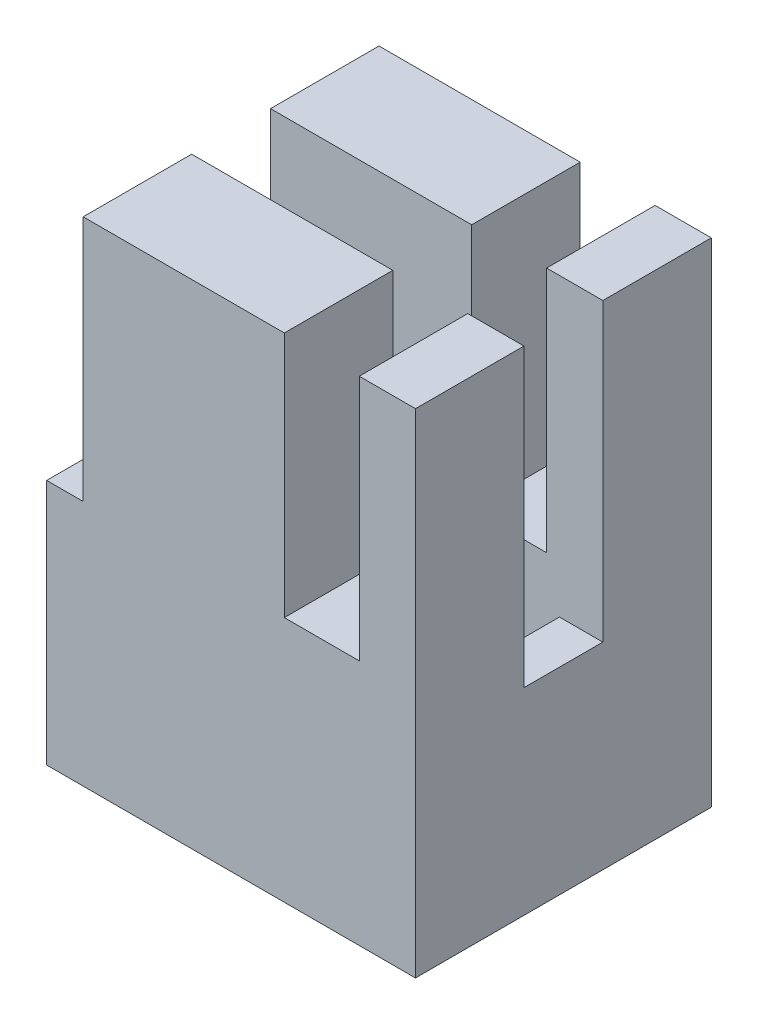
ISO-10303-21;
HEADER;
FILE_DESCRIPTION(('STEP AP214'),'2;1');
FILE_NAME('part.step','',(''),(''),'','','');
FILE_SCHEMA(('AUTOMOTIVE_DESIGN { 1 0 10303 214 1 1 1 1 }'));
ENDSEC;
DATA;
#1=APPLICATION_CONTEXT('core data for automotive mechanical design processes');
#2=APPLICATION_PROTOCOL_DEFINITION('international standard','automotive_design',2000,#1);
#3=PRODUCT_CONTEXT('',#1,'mechanical');
#4=PRODUCT('Part','Part','',(#3));
#5=PRODUCT_RELATED_PRODUCT_CATEGORY('part','',(#4));
#6=PRODUCT_DEFINITION_FORMATION('','',#4);
#7=PRODUCT_DEFINITION_CONTEXT('part definition',#1,'design');
#8=PRODUCT_DEFINITION('design','',#6,#7);
#9=PRODUCT_DEFINITION_SHAPE('','',#8);
#10=(LENGTH_UNIT() NAMED_UNIT(*) SI_UNIT(.MILLI.,.METRE.));
#11=(NAMED_UNIT(*) PLANE_ANGLE_UNIT() SI_UNIT($,.RADIAN.));
#12=(NAMED_UNIT(*) SI_UNIT($,.STERADIAN.) SOLID_ANGLE_UNIT());
#13=UNCERTAINTY_MEASURE_WITH_UNIT(LENGTH_MEASURE(1.E-05),#10,'distance_accuracy_value','');
#14=(GEOMETRIC_REPRESENTATION_CONTEXT(3) GLOBAL_UNCERTAINTY_ASSIGNED_CONTEXT((#13)) GLOBAL_UNIT_ASSIGNED_CONTEXT((#10,
#11,#12)) REPRESENTATION_CONTEXT('',''));
#15=CARTESIAN_POINT('',(0.,0.,0.));
#16=DIRECTION('',(0.,0.,1.));
#17=DIRECTION('',(1.,0.,0.));
#18=AXIS2_PLACEMENT_3D('',#15,#16,#17);
#19=CARTESIAN_POINT('',(0.,63.5,0.));
#20=DIRECTION('',(0.,1.,0.));
#21=DIRECTION('',(0.,0.,1.));
#22=AXIS2_PLACEMENT_3D('',#19,#20,#21);
#23=PLANE('',#22);
#24=DIRECTION('',(0.,0.,-1.));
#25=VECTOR('',#24,1.);
#26=CARTESIAN_POINT('',(16.51,63.5,-19.05));
#27=LINE('',#26,#25);
#28=CARTESIAN_POINT('',(16.51,63.5,19.05));
#29=VERTEX_POINT('',#28);
#30=CARTESIAN_POINT('',(16.51,63.5,5.07999999999999));
#31=VERTEX_POINT('',#30);
#32=EDGE_CURVE('E231',#29,#31,#27,.T.);
#33=ORIENTED_EDGE('',*,*,#32,.F.);
#34=DIRECTION('',(1.,0.,0.));
#35=VECTOR('',#34,1.);
#36=CARTESIAN_POINT('',(-23.749,63.5,19.05));
#37=LINE('',#36,#35);
#38=CARTESIAN_POINT('',(23.749,63.5,19.05));
#39=VERTEX_POINT('',#38);
#40=EDGE_CURVE('E249',#29,#39,#37,.T.);
#41=ORIENTED_EDGE('',*,*,#40,.T.);
#42=DIRECTION('',(0.,0.,-1.));
#43=VECTOR('',#42,1.);
#44=CARTESIAN_POINT('',(23.749,63.5,-19.05));
#45=LINE('',#44,#43);
#46=CARTESIAN_POINT('',(23.749,63.5,5.08));
#47=VERTEX_POINT('',#46);
#48=EDGE_CURVE('E255',#39,#47,#45,.T.);
#49=ORIENTED_EDGE('',*,*,#48,.T.);
#50=DIRECTION('',(1.,0.,0.));
#51=VECTOR('',#50,1.);
#52=CARTESIAN_POINT('',(-23.749,63.5,5.08));
#53=LINE('',#52,#51);
#54=EDGE_CURVE('E308',#31,#47,#53,.T.);
#55=ORIENTED_EDGE('',*,*,#54,.F.);
#56=EDGE_LOOP('',(#33,#41,#49,#55));
#57=FACE_BOUND('',#56,.T.);
#58=ADVANCED_FACE('F36',(#57),#23,.T.);
#59=CARTESIAN_POINT('',(-23.749,63.5,-19.05));
#60=DIRECTION('',(1.,0.,0.));
#61=DIRECTION('',(0.,0.,-1.));
#62=AXIS2_PLACEMENT_3D('',#59,#60,#61);
#63=PLANE('',#62);
#64=DIRECTION('',(0.,0.,-1.));
#65=VECTOR('',#64,1.);
#66=CARTESIAN_POINT('',(-23.749,31.75,-19.05));
#67=LINE('',#66,#65);
#68=CARTESIAN_POINT('',(-23.749,31.75,-5.08));
#69=VERTEX_POINT('',#68);
#70=CARTESIAN_POINT('',(-23.749,31.75,-19.05));
#71=VERTEX_POINT('',#70);
#72=EDGE_CURVE('E417',#69,#71,#67,.T.);
#73=ORIENTED_EDGE('',*,*,#72,.T.);
#74=DIRECTION('',(0.,-1.,0.));
#75=VECTOR('',#74,1.);
#76=CARTESIAN_POINT('',(-23.749,63.5,-19.05));
#77=LINE('',#76,#75);
#78=CARTESIAN_POINT('',(-23.749,0.,-19.05));
#79=VERTEX_POINT('',#78);
#80=EDGE_CURVE('E277',#71,#79,#77,.T.);
#81=ORIENTED_EDGE('',*,*,#80,.T.);
#82=DIRECTION('',(0.,0.,1.));
#83=VECTOR('',#82,1.);
#84=CARTESIAN_POINT('',(-23.749,0.,-19.05));
#85=LINE('',#84,#83);
#86=CARTESIAN_POINT('',(-23.749,0.,-8.5725));
#87=VERTEX_POINT('',#86);
#88=EDGE_CURVE('E267',#79,#87,#85,.T.);
#89=ORIENTED_EDGE('',*,*,#88,.T.);
#90=DIRECTION('',(0.,-1.,0.));
#91=VECTOR('',#90,1.);
#92=CARTESIAN_POINT('',(-23.749,70.681333074458,-8.5725));
#93=LINE('',#92,#91);
#94=CARTESIAN_POINT('',(-23.749,19.05,-8.5725));
#95=VERTEX_POINT('',#94);
#96=EDGE_CURVE('E351',#95,#87,#93,.T.);
#97=ORIENTED_EDGE('',*,*,#96,.F.);
#98=DIRECTION('',(0.,0.,-1.));
#99=VECTOR('',#98,1.);
#100=CARTESIAN_POINT('',(-23.749,19.05,-8.5725));
#101=LINE('',#100,#99);
#102=CARTESIAN_POINT('',(-23.749,19.05,8.5725));
#103=VERTEX_POINT('',#102);
#104=EDGE_CURVE('E349',#103,#95,#101,.T.);
#105=ORIENTED_EDGE('',*,*,#104,.F.);
#106=DIRECTION('',(0.,-1.,0.));
#107=VECTOR('',#106,1.);
#108=CARTESIAN_POINT('',(-23.749,70.681333074458,8.5725));
#109=LINE('',#108,#107);
#110=CARTESIAN_POINT('',(-23.749,0.,8.5725));
#111=VERTEX_POINT('',#110);
#112=EDGE_CURVE('E346',#103,#111,#109,.T.);
#113=ORIENTED_EDGE('',*,*,#112,.T.);
#114=CARTESIAN_POINT('',(-23.749,0.,19.05));
#115=VERTEX_POINT('',#114);
#116=EDGE_CURVE('E266',#111,#115,#85,.T.);
#117=ORIENTED_EDGE('',*,*,#116,.T.);
#118=DIRECTION('',(0.,-1.,0.));
#119=VECTOR('',#118,1.);
#120=CARTESIAN_POINT('',(-23.749,63.5,19.05));
#121=LINE('',#120,#119);
#122=CARTESIAN_POINT('',(-23.749,31.75,19.05));
#123=VERTEX_POINT('',#122);
#124=EDGE_CURVE('E275',#123,#115,#121,.T.);
#125=ORIENTED_EDGE('',*,*,#124,.F.);
#126=CARTESIAN_POINT('',(-23.749,31.75,5.08));
#127=VERTEX_POINT('',#126);
#128=EDGE_CURVE('E407',#123,#127,#67,.T.);
#129=ORIENTED_EDGE('',*,*,#128,.T.);
#130=DIRECTION('',(0.,1.,0.));
#131=VECTOR('',#130,1.);
#132=CARTESIAN_POINT('',(-23.749,25.4,5.08));
#133=LINE('',#132,#131);
#134=CARTESIAN_POINT('',(-23.749,25.4,5.08));
#135=VERTEX_POINT('',#134);
#136=EDGE_CURVE('E320',#135,#127,#133,.T.);
#137=ORIENTED_EDGE('',*,*,#136,.F.);
#138=DIRECTION('',(0.,0.,1.));
#139=VECTOR('',#138,1.);
#140=CARTESIAN_POINT('',(-23.749,25.4,-5.08));
#141=LINE('',#140,#139);
#142=CARTESIAN_POINT('',(-23.749,25.4,-5.08));
#143=VERTEX_POINT('',#142);
#144=EDGE_CURVE('E332',#143,#135,#141,.T.);
#145=ORIENTED_EDGE('',*,*,#144,.F.);
#146=DIRECTION('',(0.,1.,0.));
#147=VECTOR('',#146,1.);
#148=CARTESIAN_POINT('',(-23.749,25.4,-5.08));
#149=LINE('',#148,#147);
#150=EDGE_CURVE('E323',#143,#69,#149,.T.);
#151=ORIENTED_EDGE('',*,*,#150,.T.);
#152=EDGE_LOOP('',(#73,#81,#89,#97,#105,#113,#117,#125,#129,#137,#145,#151));
#153=FACE_BOUND('',#152,.T.);
#154=ADVANCED_FACE('F456',(#153),#63,.F.);
#155=CARTESIAN_POINT('',(16.51,63.5,-5.08));
#156=VERTEX_POINT('',#155);
#157=CARTESIAN_POINT('',(16.51,63.5,-19.05));
#158=VERTEX_POINT('',#157);
#159=EDGE_CURVE('E221',#156,#158,#27,.T.);
#160=ORIENTED_EDGE('',*,*,#159,.F.);
#161=DIRECTION('',(-1.,0.,0.));
#162=VECTOR('',#161,1.);
#163=CARTESIAN_POINT('',(-23.749,63.5,-5.08));
#164=LINE('',#163,#162);
#165=CARTESIAN_POINT('',(23.749,63.5,-5.08));
#166=VERTEX_POINT('',#165);
#167=EDGE_CURVE('E305',#166,#156,#164,.T.);
#168=ORIENTED_EDGE('',*,*,#167,.F.);
#169=CARTESIAN_POINT('',(23.749,63.5,-19.05));
#170=VERTEX_POINT('',#169);
#171=EDGE_CURVE('E248',#166,#170,#45,.T.);
#172=ORIENTED_EDGE('',*,*,#171,.T.);
#173=DIRECTION('',(-1.,0.,0.));
#174=VECTOR('',#173,1.);
#175=CARTESIAN_POINT('',(-23.749,63.5,-19.05));
#176=LINE('',#175,#174);
#177=EDGE_CURVE('E238',#170,#158,#176,.T.);
#178=ORIENTED_EDGE('',*,*,#177,.T.);
#179=EDGE_LOOP('',(#160,#168,#172,#178));
#180=FACE_BOUND('',#179,.T.);
#181=ADVANCED_FACE('F246',(#180),#23,.T.);
#182=CARTESIAN_POINT('',(0.,25.4,0.));
#183=DIRECTION('',(0.,1.,0.));
#184=DIRECTION('',(0.,0.,1.));
#185=AXIS2_PLACEMENT_3D('',#182,#183,#184);
#186=PLANE('',#185);
#187=DIRECTION('',(0.,0.,-1.));
#188=VECTOR('',#187,1.);
#189=CARTESIAN_POINT('',(18.161,25.4,5.08));
#190=LINE('',#189,#188);
#191=CARTESIAN_POINT('',(18.161,25.4,5.08));
#192=VERTEX_POINT('',#191);
#193=CARTESIAN_POINT('',(18.161,25.4,-5.08));
#194=VERTEX_POINT('',#193);
#195=EDGE_CURVE('E390',#192,#194,#190,.T.);
#196=ORIENTED_EDGE('',*,*,#195,.F.);
#197=DIRECTION('',(1.,0.,0.));
#198=VECTOR('',#197,1.);
#199=CARTESIAN_POINT('',(-23.749,25.4,5.08));
#200=LINE('',#199,#198);
#201=CARTESIAN_POINT('',(23.749,25.4,5.08));
#202=VERTEX_POINT('',#201);
#203=EDGE_CURVE('E328',#192,#202,#200,.T.);
#204=ORIENTED_EDGE('',*,*,#203,.T.);
#205=DIRECTION('',(0.,0.,-1.));
#206=VECTOR('',#205,1.);
#207=CARTESIAN_POINT('',(23.749,25.4,-5.08));
#208=LINE('',#207,#206);
#209=CARTESIAN_POINT('',(23.749,25.4,-5.08));
#210=VERTEX_POINT('',#209);
#211=EDGE_CURVE('E344',#202,#210,#208,.T.);
#212=ORIENTED_EDGE('',*,*,#211,.T.);
#213=DIRECTION('',(-1.,0.,0.));
#214=VECTOR('',#213,1.);
#215=CARTESIAN_POINT('',(-23.749,25.4,-5.08));
#216=LINE('',#215,#214);
#217=EDGE_CURVE('E338',#210,#194,#216,.T.);
#218=ORIENTED_EDGE('',*,*,#217,.T.);
#219=EDGE_LOOP('',(#196,#204,#212,#218));
#220=FACE_BOUND('',#219,.T.);
#221=ADVANCED_FACE('F503',(#220),#186,.T.);
#222=DIRECTION('',(0.,0.,1.));
#223=VECTOR('',#222,1.);
#224=CARTESIAN_POINT('',(6.858,63.5,-19.05));
#225=LINE('',#224,#223);
#226=CARTESIAN_POINT('',(6.858,63.5,5.07999999999999));
#227=VERTEX_POINT('',#226);
#228=CARTESIAN_POINT('',(6.858,63.5,19.05));
#229=VERTEX_POINT('',#228);
#230=EDGE_CURVE('E433',#227,#229,#225,.T.);
#231=ORIENTED_EDGE('',*,*,#230,.F.);
#232=CARTESIAN_POINT('',(-19.05,63.5,5.07999999999999));
#233=VERTEX_POINT('',#232);
#234=EDGE_CURVE('E317',#233,#227,#53,.T.);
#235=ORIENTED_EDGE('',*,*,#234,.F.);
#236=DIRECTION('',(0.,0.,-1.));
#237=VECTOR('',#236,1.);
#238=CARTESIAN_POINT('',(-19.05,63.5,-19.05));
#239=LINE('',#238,#237);
#240=CARTESIAN_POINT('',(-19.05,63.5,19.05));
#241=VERTEX_POINT('',#240);
#242=EDGE_CURVE('E411',#241,#233,#239,.T.);
#243=ORIENTED_EDGE('',*,*,#242,.F.);
#244=EDGE_CURVE('E252',#241,#229,#37,.T.);
#245=ORIENTED_EDGE('',*,*,#244,.T.);
#246=EDGE_LOOP('',(#231,#235,#243,#245));
#247=FACE_BOUND('',#246,.T.);
#248=ADVANCED_FACE('F517',(#247),#23,.T.);
#249=CARTESIAN_POINT('',(23.749,63.5,-19.05));
#250=DIRECTION('',(-1.,0.,0.));
#251=DIRECTION('',(0.,0.,1.));
#252=AXIS2_PLACEMENT_3D('',#249,#250,#251);
#253=PLANE('',#252);
#254=ORIENTED_EDGE('',*,*,#211,.F.);
#255=DIRECTION('',(0.,1.,0.));
#256=VECTOR('',#255,1.);
#257=CARTESIAN_POINT('',(23.749,25.4,5.08));
#258=LINE('',#257,#256);
#259=EDGE_CURVE('E263',#202,#47,#258,.T.);
#260=ORIENTED_EDGE('',*,*,#259,.T.);
#261=ORIENTED_EDGE('',*,*,#48,.F.);
#262=DIRECTION('',(0.,-1.,0.));
#263=VECTOR('',#262,1.);
#264=CARTESIAN_POINT('',(23.749,63.5,19.05));
#265=LINE('',#264,#263);
#266=CARTESIAN_POINT('',(23.749,0.,19.05));
#267=VERTEX_POINT('',#266);
#268=EDGE_CURVE('E272',#39,#267,#265,.T.);
#269=ORIENTED_EDGE('',*,*,#268,.T.);
#270=DIRECTION('',(0.,0.,-1.));
#271=VECTOR('',#270,1.);
#272=CARTESIAN_POINT('',(23.749,0.,-19.05));
#273=LINE('',#272,#271);
#274=CARTESIAN_POINT('',(23.749,0.,-19.05));
#275=VERTEX_POINT('',#274);
#276=EDGE_CURVE('E259',#267,#275,#273,.T.);
#277=ORIENTED_EDGE('',*,*,#276,.T.);
#278=DIRECTION('',(0.,-1.,0.));
#279=VECTOR('',#278,1.);
#280=CARTESIAN_POINT('',(23.749,63.5,-19.05));
#281=LINE('',#280,#279);
#282=EDGE_CURVE('E279',#170,#275,#281,.T.);
#283=ORIENTED_EDGE('',*,*,#282,.F.);
#284=ORIENTED_EDGE('',*,*,#171,.F.);
#285=DIRECTION('',(0.,1.,0.));
#286=VECTOR('',#285,1.);
#287=CARTESIAN_POINT('',(23.749,25.4,-5.08));
#288=LINE('',#287,#286);
#289=EDGE_CURVE('E325',#210,#166,#288,.T.);
#290=ORIENTED_EDGE('',*,*,#289,.F.);
#291=EDGE_LOOP('',(#254,#260,#261,#269,#277,#283,#284,#290));
#292=FACE_BOUND('',#291,.T.);
#293=ADVANCED_FACE('F38',(#292),#253,.F.);
#294=CARTESIAN_POINT('',(-23.749,63.5,-19.05));
#295=DIRECTION('',(0.,0.,1.));
#296=DIRECTION('',(1.,0.,0.));
#297=AXIS2_PLACEMENT_3D('',#294,#295,#296);
#298=PLANE('',#297);
#299=DIRECTION('',(1.,0.,0.));
#300=VECTOR('',#299,1.);
#301=CARTESIAN_POINT('',(16.51,31.75,-19.05));
#302=LINE('',#301,#300);
#303=CARTESIAN_POINT('',(6.858,31.75,-19.05));
#304=VERTEX_POINT('',#303);
#305=CARTESIAN_POINT('',(16.51,31.75,-19.05));
#306=VERTEX_POINT('',#305);
#307=EDGE_CURVE('E242',#304,#306,#302,.T.);
#308=ORIENTED_EDGE('',*,*,#307,.T.);
#309=DIRECTION('',(0.,1.,0.));
#310=VECTOR('',#309,1.);
#311=CARTESIAN_POINT('',(16.51,-13.9035762240537,-19.05));
#312=LINE('',#311,#310);
#313=EDGE_CURVE('E225',#306,#158,#312,.T.);
#314=ORIENTED_EDGE('',*,*,#313,.T.);
#315=ORIENTED_EDGE('',*,*,#177,.F.);
#316=ORIENTED_EDGE('',*,*,#282,.T.);
#317=DIRECTION('',(-1.,0.,0.));
#318=VECTOR('',#317,1.);
#319=CARTESIAN_POINT('',(-23.749,0.,-19.05));
#320=LINE('',#319,#318);
#321=EDGE_CURVE('E262',#275,#79,#320,.T.);
#322=ORIENTED_EDGE('',*,*,#321,.T.);
#323=ORIENTED_EDGE('',*,*,#80,.F.);
#324=DIRECTION('',(1.,0.,0.));
#325=VECTOR('',#324,1.);
#326=CARTESIAN_POINT('',(-23.749,31.75,-19.05));
#327=LINE('',#326,#325);
#328=CARTESIAN_POINT('',(-19.05,31.75,-19.05));
#329=VERTEX_POINT('',#328);
#330=EDGE_CURVE('E418',#71,#329,#327,.T.);
#331=ORIENTED_EDGE('',*,*,#330,.T.);
#332=DIRECTION('',(0.,1.,0.));
#333=VECTOR('',#332,1.);
#334=CARTESIAN_POINT('',(-19.05,-13.9035762240537,-19.05));
#335=LINE('',#334,#333);
#336=CARTESIAN_POINT('',(-19.05,63.5,-19.05));
#337=VERTEX_POINT('',#336);
#338=EDGE_CURVE('E410',#329,#337,#335,.T.);
#339=ORIENTED_EDGE('',*,*,#338,.T.);
#340=CARTESIAN_POINT('',(6.858,63.5,-19.05));
#341=VERTEX_POINT('',#340);
#342=EDGE_CURVE('E250',#341,#337,#176,.T.);
#343=ORIENTED_EDGE('',*,*,#342,.F.);
#344=DIRECTION('',(0.,1.,0.));
#345=VECTOR('',#344,1.);
#346=CARTESIAN_POINT('',(6.858,-13.9035762240537,-19.05));
#347=LINE('',#346,#345);
#348=EDGE_CURVE('E243',#304,#341,#347,.T.);
#349=ORIENTED_EDGE('',*,*,#348,.F.);
#350=EDGE_LOOP('',(#308,#314,#315,#316,#322,#323,#331,#339,#343,#349));
#351=FACE_BOUND('',#350,.T.);
#352=ADVANCED_FACE('F236',(#351),#298,.F.);
#353=CARTESIAN_POINT('',(-23.749,63.5,19.05));
#354=DIRECTION('',(0.,0.,-1.));
#355=DIRECTION('',(-1.,0.,0.));
#356=AXIS2_PLACEMENT_3D('',#353,#354,#355);
#357=PLANE('',#356);
#358=ORIENTED_EDGE('',*,*,#40,.F.);
#359=DIRECTION('',(0.,1.,0.));
#360=VECTOR('',#359,1.);
#361=CARTESIAN_POINT('',(16.51,-13.9035762240537,19.05));
#362=LINE('',#361,#360);
#363=CARTESIAN_POINT('',(16.51,31.75,19.05));
#364=VERTEX_POINT('',#363);
#365=EDGE_CURVE('E430',#364,#29,#362,.T.);
#366=ORIENTED_EDGE('',*,*,#365,.F.);
#367=DIRECTION('',(-1.,0.,0.));
#368=VECTOR('',#367,1.);
#369=CARTESIAN_POINT('',(16.51,31.75,19.05));
#370=LINE('',#369,#368);
#371=CARTESIAN_POINT('',(6.858,31.75,19.05));
#372=VERTEX_POINT('',#371);
#373=EDGE_CURVE('E436',#364,#372,#370,.T.);
#374=ORIENTED_EDGE('',*,*,#373,.T.);
#375=DIRECTION('',(0.,1.,0.));
#376=VECTOR('',#375,1.);
#377=CARTESIAN_POINT('',(6.858,-13.9035762240537,19.05));
#378=LINE('',#377,#376);
#379=EDGE_CURVE('E427',#372,#229,#378,.T.);
#380=ORIENTED_EDGE('',*,*,#379,.T.);
#381=ORIENTED_EDGE('',*,*,#244,.F.);
#382=DIRECTION('',(0.,1.,0.));
#383=VECTOR('',#382,1.);
#384=CARTESIAN_POINT('',(-19.05,-13.9035762240537,19.05));
#385=LINE('',#384,#383);
#386=CARTESIAN_POINT('',(-19.05,31.75,19.05));
#387=VERTEX_POINT('',#386);
#388=EDGE_CURVE('E408',#387,#241,#385,.T.);
#389=ORIENTED_EDGE('',*,*,#388,.F.);
#390=DIRECTION('',(-1.,0.,0.));
#391=VECTOR('',#390,1.);
#392=CARTESIAN_POINT('',(-23.749,31.75,19.05));
#393=LINE('',#392,#391);
#394=EDGE_CURVE('E232',#387,#123,#393,.T.);
#395=ORIENTED_EDGE('',*,*,#394,.T.);
#396=ORIENTED_EDGE('',*,*,#124,.T.);
#397=DIRECTION('',(1.,0.,0.));
#398=VECTOR('',#397,1.);
#399=CARTESIAN_POINT('',(-23.749,0.,19.05));
#400=LINE('',#399,#398);
#401=EDGE_CURVE('E270',#115,#267,#400,.T.);
#402=ORIENTED_EDGE('',*,*,#401,.T.);
#403=ORIENTED_EDGE('',*,*,#268,.F.);
#404=EDGE_LOOP('',(#358,#366,#374,#380,#381,#389,#395,#396,#402,#403));
#405=FACE_BOUND('',#404,.T.);
#406=ADVANCED_FACE('F494',(#405),#357,.F.);
#407=CARTESIAN_POINT('',(6.858,63.5,-5.08));
#408=VERTEX_POINT('',#407);
#409=EDGE_CURVE('E244',#341,#408,#225,.T.);
#410=ORIENTED_EDGE('',*,*,#409,.F.);
#411=ORIENTED_EDGE('',*,*,#342,.T.);
#412=CARTESIAN_POINT('',(-19.05,63.5,-5.08));
#413=VERTEX_POINT('',#412);
#414=EDGE_CURVE('E304',#413,#337,#239,.T.);
#415=ORIENTED_EDGE('',*,*,#414,.F.);
#416=EDGE_CURVE('E297',#408,#413,#164,.T.);
#417=ORIENTED_EDGE('',*,*,#416,.F.);
#418=EDGE_LOOP('',(#410,#411,#415,#417));
#419=FACE_BOUND('',#418,.T.);
#420=ADVANCED_FACE('F302',(#419),#23,.T.);
#421=CARTESIAN_POINT('',(0.,0.,0.));
#422=DIRECTION('',(0.,1.,0.));
#423=DIRECTION('',(0.,0.,1.));
#424=AXIS2_PLACEMENT_3D('',#421,#422,#423);
#425=PLANE('',#424);
#426=ORIENTED_EDGE('',*,*,#116,.F.);
#427=DIRECTION('',(-1.,0.,0.));
#428=VECTOR('',#427,1.);
#429=CARTESIAN_POINT('',(-23.749,0.,8.5725));
#430=LINE('',#429,#428);
#431=CARTESIAN_POINT('',(18.161,0.,8.5725));
#432=VERTEX_POINT('',#431);
#433=EDGE_CURVE('E369',#432,#111,#430,.T.);
#434=ORIENTED_EDGE('',*,*,#433,.F.);
#435=DIRECTION('',(0.,0.,1.));
#436=VECTOR('',#435,1.);
#437=CARTESIAN_POINT('',(18.161,0.,-8.5725));
#438=LINE('',#437,#436);
#439=CARTESIAN_POINT('',(18.161,0.,-8.5725));
#440=VERTEX_POINT('',#439);
#441=EDGE_CURVE('E367',#440,#432,#438,.T.);
#442=ORIENTED_EDGE('',*,*,#441,.F.);
#443=DIRECTION('',(1.,0.,0.));
#444=VECTOR('',#443,1.);
#445=CARTESIAN_POINT('',(-23.749,0.,-8.5725));
#446=LINE('',#445,#444);
#447=EDGE_CURVE('E366',#87,#440,#446,.T.);
#448=ORIENTED_EDGE('',*,*,#447,.F.);
#449=ORIENTED_EDGE('',*,*,#88,.F.);
#450=ORIENTED_EDGE('',*,*,#321,.F.);
#451=ORIENTED_EDGE('',*,*,#276,.F.);
#452=ORIENTED_EDGE('',*,*,#401,.F.);
#453=EDGE_LOOP('',(#426,#434,#442,#448,#449,#450,#451,#452));
#454=FACE_BOUND('',#453,.T.);
#455=ADVANCED_FACE('F482',(#454),#425,.F.);
#456=CARTESIAN_POINT('',(-23.749,25.4,5.08));
#457=DIRECTION('',(0.,0.,1.));
#458=DIRECTION('',(1.,0.,0.));
#459=AXIS2_PLACEMENT_3D('',#456,#457,#458);
#460=PLANE('',#459);
#461=DIRECTION('',(-1.,0.,0.));
#462=VECTOR('',#461,1.);
#463=CARTESIAN_POINT('',(-23.749,31.75,5.08));
#464=LINE('',#463,#462);
#465=CARTESIAN_POINT('',(16.51,31.75,5.08));
#466=VERTEX_POINT('',#465);
#467=CARTESIAN_POINT('',(6.858,31.75,5.08));
#468=VERTEX_POINT('',#467);
#469=EDGE_CURVE('E398',#466,#468,#464,.T.);
#470=ORIENTED_EDGE('',*,*,#469,.F.);
#471=DIRECTION('',(0.,1.,0.));
#472=VECTOR('',#471,1.);
#473=CARTESIAN_POINT('',(16.51,25.4,5.08));
#474=LINE('',#473,#472);
#475=EDGE_CURVE('E392',#466,#31,#474,.T.);
#476=ORIENTED_EDGE('',*,*,#475,.T.);
#477=ORIENTED_EDGE('',*,*,#54,.T.);
#478=ORIENTED_EDGE('',*,*,#259,.F.);
#479=ORIENTED_EDGE('',*,*,#203,.F.);
#480=DIRECTION('',(0.,1.,0.));
#481=VECTOR('',#480,1.);
#482=CARTESIAN_POINT('',(18.161,0.,5.08));
#483=LINE('',#482,#481);
#484=CARTESIAN_POINT('',(18.161,19.05,5.08));
#485=VERTEX_POINT('',#484);
#486=EDGE_CURVE('E378',#485,#192,#483,.T.);
#487=ORIENTED_EDGE('',*,*,#486,.F.);
#488=DIRECTION('',(1.,0.,0.));
#489=VECTOR('',#488,1.);
#490=CARTESIAN_POINT('',(0.,19.05,5.08));
#491=LINE('',#490,#489);
#492=CARTESIAN_POINT('',(-21.971,19.05,5.08));
#493=VERTEX_POINT('',#492);
#494=EDGE_CURVE('E370',#493,#485,#491,.T.);
#495=ORIENTED_EDGE('',*,*,#494,.F.);
#496=DIRECTION('',(0.,1.,0.));
#497=VECTOR('',#496,1.);
#498=CARTESIAN_POINT('',(-21.971,0.,5.08));
#499=LINE('',#498,#497);
#500=CARTESIAN_POINT('',(-21.971,25.4,5.08));
#501=VERTEX_POINT('',#500);
#502=EDGE_CURVE('E385',#493,#501,#499,.T.);
#503=ORIENTED_EDGE('',*,*,#502,.T.);
#504=EDGE_CURVE('E314',#135,#501,#200,.T.);
#505=ORIENTED_EDGE('',*,*,#504,.F.);
#506=ORIENTED_EDGE('',*,*,#136,.T.);
#507=DIRECTION('',(-1.,0.,0.));
#508=VECTOR('',#507,1.);
#509=CARTESIAN_POINT('',(-23.749,31.75,5.08));
#510=LINE('',#509,#508);
#511=CARTESIAN_POINT('',(-19.05,31.75,5.08));
#512=VERTEX_POINT('',#511);
#513=EDGE_CURVE('E403',#512,#127,#510,.T.);
#514=ORIENTED_EDGE('',*,*,#513,.F.);
#515=DIRECTION('',(0.,1.,0.));
#516=VECTOR('',#515,1.);
#517=CARTESIAN_POINT('',(-19.05,25.4,5.08));
#518=LINE('',#517,#516);
#519=EDGE_CURVE('E400',#512,#233,#518,.T.);
#520=ORIENTED_EDGE('',*,*,#519,.T.);
#521=ORIENTED_EDGE('',*,*,#234,.T.);
#522=DIRECTION('',(0.,-1.,0.));
#523=VECTOR('',#522,1.);
#524=CARTESIAN_POINT('',(6.858,25.4,5.08));
#525=LINE('',#524,#523);
#526=EDGE_CURVE('E395',#227,#468,#525,.T.);
#527=ORIENTED_EDGE('',*,*,#526,.T.);
#528=EDGE_LOOP('',(#470,#476,#477,#478,#479,#487,#495,#503,#505,#506,#514,#520,#521,#527));
#529=FACE_BOUND('',#528,.T.);
#530=ADVANCED_FACE('F462',(#529),#460,.F.);
#531=CARTESIAN_POINT('',(-23.749,25.4,-5.08));
#532=DIRECTION('',(0.,0.,-1.));
#533=DIRECTION('',(-1.,0.,0.));
#534=AXIS2_PLACEMENT_3D('',#531,#532,#533);
#535=PLANE('',#534);
#536=ORIENTED_EDGE('',*,*,#167,.T.);
#537=DIRECTION('',(0.,-1.,0.));
#538=VECTOR('',#537,1.);
#539=CARTESIAN_POINT('',(16.51,25.4,-5.08));
#540=LINE('',#539,#538);
#541=CARTESIAN_POINT('',(16.51,31.75,-5.08));
#542=VERTEX_POINT('',#541);
#543=EDGE_CURVE('E13',#156,#542,#540,.T.);
#544=ORIENTED_EDGE('',*,*,#543,.T.);
#545=DIRECTION('',(1.,0.,0.));
#546=VECTOR('',#545,1.);
#547=CARTESIAN_POINT('',(-23.749,31.75,-5.08));
#548=LINE('',#547,#546);
#549=CARTESIAN_POINT('',(6.858,31.75,-5.08));
#550=VERTEX_POINT('',#549);
#551=EDGE_CURVE('E289',#550,#542,#548,.T.);
#552=ORIENTED_EDGE('',*,*,#551,.F.);
#553=DIRECTION('',(0.,1.,0.));
#554=VECTOR('',#553,1.);
#555=CARTESIAN_POINT('',(6.858,25.4,-5.08));
#556=LINE('',#555,#554);
#557=EDGE_CURVE('E44',#550,#408,#556,.T.);
#558=ORIENTED_EDGE('',*,*,#557,.T.);
#559=ORIENTED_EDGE('',*,*,#416,.T.);
#560=DIRECTION('',(0.,-1.,0.));
#561=VECTOR('',#560,1.);
#562=CARTESIAN_POINT('',(-19.05,25.4,-5.08));
#563=LINE('',#562,#561);
#564=CARTESIAN_POINT('',(-19.05,31.75,-5.08));
#565=VERTEX_POINT('',#564);
#566=EDGE_CURVE('E286',#413,#565,#563,.T.);
#567=ORIENTED_EDGE('',*,*,#566,.T.);
#568=DIRECTION('',(1.,0.,0.));
#569=VECTOR('',#568,1.);
#570=CARTESIAN_POINT('',(-23.749,31.75,-5.08));
#571=LINE('',#570,#569);
#572=EDGE_CURVE('E284',#69,#565,#571,.T.);
#573=ORIENTED_EDGE('',*,*,#572,.F.);
#574=ORIENTED_EDGE('',*,*,#150,.F.);
#575=CARTESIAN_POINT('',(-21.971,25.4,-5.08));
#576=VERTEX_POINT('',#575);
#577=EDGE_CURVE('E341',#576,#143,#216,.T.);
#578=ORIENTED_EDGE('',*,*,#577,.F.);
#579=DIRECTION('',(0.,1.,0.));
#580=VECTOR('',#579,1.);
#581=CARTESIAN_POINT('',(-21.971,0.,-5.08));
#582=LINE('',#581,#580);
#583=CARTESIAN_POINT('',(-21.971,19.05,-5.08));
#584=VERTEX_POINT('',#583);
#585=EDGE_CURVE('E382',#584,#576,#582,.T.);
#586=ORIENTED_EDGE('',*,*,#585,.F.);
#587=DIRECTION('',(-1.,0.,0.));
#588=VECTOR('',#587,1.);
#589=CARTESIAN_POINT('',(0.,19.05,-5.08));
#590=LINE('',#589,#588);
#591=CARTESIAN_POINT('',(18.161,19.05,-5.08));
#592=VERTEX_POINT('',#591);
#593=EDGE_CURVE('E375',#592,#584,#590,.T.);
#594=ORIENTED_EDGE('',*,*,#593,.F.);
#595=DIRECTION('',(0.,1.,0.));
#596=VECTOR('',#595,1.);
#597=CARTESIAN_POINT('',(18.161,0.,-5.08));
#598=LINE('',#597,#596);
#599=EDGE_CURVE('E379',#592,#194,#598,.T.);
#600=ORIENTED_EDGE('',*,*,#599,.T.);
#601=ORIENTED_EDGE('',*,*,#217,.F.);
#602=ORIENTED_EDGE('',*,*,#289,.T.);
#603=EDGE_LOOP('',(#536,#544,#552,#558,#559,#567,#573,#574,#578,#586,#594,#600,#601,#602));
#604=FACE_BOUND('',#603,.T.);
#605=ADVANCED_FACE('F296',(#604),#535,.F.);
#606=DIRECTION('',(0.,0.,1.));
#607=VECTOR('',#606,1.);
#608=CARTESIAN_POINT('',(-21.971,25.4,5.08));
#609=LINE('',#608,#607);
#610=EDGE_CURVE('E383',#576,#501,#609,.T.);
#611=ORIENTED_EDGE('',*,*,#610,.F.);
#612=ORIENTED_EDGE('',*,*,#577,.T.);
#613=ORIENTED_EDGE('',*,*,#144,.T.);
#614=ORIENTED_EDGE('',*,*,#504,.T.);
#615=EDGE_LOOP('',(#611,#612,#613,#614));
#616=FACE_BOUND('',#615,.T.);
#617=ADVANCED_FACE('F467',(#616),#186,.T.);
#618=CARTESIAN_POINT('',(0.,19.05,0.));
#619=DIRECTION('',(0.,1.,0.));
#620=DIRECTION('',(0.,0.,1.));
#621=AXIS2_PLACEMENT_3D('',#618,#619,#620);
#622=PLANE('',#621);
#623=DIRECTION('',(0.,0.,1.));
#624=VECTOR('',#623,1.);
#625=CARTESIAN_POINT('',(-21.971,19.05,0.));
#626=LINE('',#625,#624);
#627=EDGE_CURVE('E281',#584,#493,#626,.T.);
#628=ORIENTED_EDGE('',*,*,#627,.T.);
#629=ORIENTED_EDGE('',*,*,#494,.T.);
#630=DIRECTION('',(0.,0.,1.));
#631=VECTOR('',#630,1.);
#632=CARTESIAN_POINT('',(18.161,19.05,-8.5725));
#633=LINE('',#632,#631);
#634=CARTESIAN_POINT('',(18.161,19.05,8.5725));
#635=VERTEX_POINT('',#634);
#636=EDGE_CURVE('E357',#485,#635,#633,.T.);
#637=ORIENTED_EDGE('',*,*,#636,.T.);
#638=DIRECTION('',(-1.,0.,0.));
#639=VECTOR('',#638,1.);
#640=CARTESIAN_POINT('',(-23.749,19.05,8.5725));
#641=LINE('',#640,#639);
#642=EDGE_CURVE('E350',#635,#103,#641,.T.);
#643=ORIENTED_EDGE('',*,*,#642,.T.);
#644=ORIENTED_EDGE('',*,*,#104,.T.);
#645=DIRECTION('',(1.,0.,0.));
#646=VECTOR('',#645,1.);
#647=CARTESIAN_POINT('',(-23.749,19.05,-8.5725));
#648=LINE('',#647,#646);
#649=CARTESIAN_POINT('',(18.161,19.05,-8.5725));
#650=VERTEX_POINT('',#649);
#651=EDGE_CURVE('E353',#95,#650,#648,.T.);
#652=ORIENTED_EDGE('',*,*,#651,.T.);
#653=EDGE_CURVE('E310',#650,#592,#633,.T.);
#654=ORIENTED_EDGE('',*,*,#653,.T.);
#655=ORIENTED_EDGE('',*,*,#593,.T.);
#656=EDGE_LOOP('',(#628,#629,#637,#643,#644,#652,#654,#655));
#657=FACE_BOUND('',#656,.T.);
#658=ADVANCED_FACE('F470',(#657),#622,.F.);
#659=CARTESIAN_POINT('',(-23.749,70.681333074458,8.5725));
#660=DIRECTION('',(0.,0.,1.));
#661=DIRECTION('',(1.,0.,0.));
#662=AXIS2_PLACEMENT_3D('',#659,#660,#661);
#663=PLANE('',#662);
#664=DIRECTION('',(0.,-1.,0.));
#665=VECTOR('',#664,1.);
#666=CARTESIAN_POINT('',(18.161,70.681333074458,8.5725));
#667=LINE('',#666,#665);
#668=EDGE_CURVE('E306',#635,#432,#667,.T.);
#669=ORIENTED_EDGE('',*,*,#668,.T.);
#670=ORIENTED_EDGE('',*,*,#433,.T.);
#671=ORIENTED_EDGE('',*,*,#112,.F.);
#672=ORIENTED_EDGE('',*,*,#642,.F.);
#673=EDGE_LOOP('',(#669,#670,#671,#672));
#674=FACE_BOUND('',#673,.T.);
#675=ADVANCED_FACE('F499',(#674),#663,.F.);
#676=CARTESIAN_POINT('',(-23.749,70.681333074458,-8.5725));
#677=DIRECTION('',(0.,0.,-1.));
#678=DIRECTION('',(-1.,0.,0.));
#679=AXIS2_PLACEMENT_3D('',#676,#677,#678);
#680=PLANE('',#679);
#681=ORIENTED_EDGE('',*,*,#96,.T.);
#682=ORIENTED_EDGE('',*,*,#447,.T.);
#683=DIRECTION('',(0.,-1.,0.));
#684=VECTOR('',#683,1.);
#685=CARTESIAN_POINT('',(18.161,70.681333074458,-8.5725));
#686=LINE('',#685,#684);
#687=EDGE_CURVE('E354',#650,#440,#686,.T.);
#688=ORIENTED_EDGE('',*,*,#687,.F.);
#689=ORIENTED_EDGE('',*,*,#651,.F.);
#690=EDGE_LOOP('',(#681,#682,#688,#689));
#691=FACE_BOUND('',#690,.T.);
#692=ADVANCED_FACE('F476',(#691),#680,.F.);
#693=CARTESIAN_POINT('',(18.161,70.681333074458,-8.5725));
#694=DIRECTION('',(1.,0.,0.));
#695=DIRECTION('',(0.,0.,-1.));
#696=AXIS2_PLACEMENT_3D('',#693,#694,#695);
#697=PLANE('',#696);
#698=ORIENTED_EDGE('',*,*,#441,.T.);
#699=ORIENTED_EDGE('',*,*,#668,.F.);
#700=ORIENTED_EDGE('',*,*,#636,.F.);
#701=ORIENTED_EDGE('',*,*,#486,.T.);
#702=ORIENTED_EDGE('',*,*,#195,.T.);
#703=ORIENTED_EDGE('',*,*,#599,.F.);
#704=ORIENTED_EDGE('',*,*,#653,.F.);
#705=ORIENTED_EDGE('',*,*,#687,.T.);
#706=EDGE_LOOP('',(#698,#699,#700,#701,#702,#703,#704,#705));
#707=FACE_BOUND('',#706,.T.);
#708=ADVANCED_FACE('F473',(#707),#697,.F.);
#709=CARTESIAN_POINT('',(-21.971,0.,5.08));
#710=DIRECTION('',(-1.,0.,0.));
#711=DIRECTION('',(0.,0.,1.));
#712=AXIS2_PLACEMENT_3D('',#709,#710,#711);
#713=PLANE('',#712);
#714=ORIENTED_EDGE('',*,*,#585,.T.);
#715=ORIENTED_EDGE('',*,*,#610,.T.);
#716=ORIENTED_EDGE('',*,*,#502,.F.);
#717=ORIENTED_EDGE('',*,*,#627,.F.);
#718=EDGE_LOOP('',(#714,#715,#716,#717));
#719=FACE_BOUND('',#718,.T.);
#720=ADVANCED_FACE('F466',(#719),#713,.F.);
#721=CARTESIAN_POINT('',(0.,31.75,0.));
#722=DIRECTION('',(0.,1.,0.));
#723=DIRECTION('',(0.,0.,1.));
#724=AXIS2_PLACEMENT_3D('',#721,#722,#723);
#725=PLANE('',#724);
#726=ORIENTED_EDGE('',*,*,#572,.T.);
#727=DIRECTION('',(0.,0.,1.));
#728=VECTOR('',#727,1.);
#729=CARTESIAN_POINT('',(-19.05,31.75,-19.05));
#730=LINE('',#729,#728);
#731=EDGE_CURVE('E421',#329,#565,#730,.T.);
#732=ORIENTED_EDGE('',*,*,#731,.F.);
#733=ORIENTED_EDGE('',*,*,#330,.F.);
#734=ORIENTED_EDGE('',*,*,#72,.F.);
#735=EDGE_LOOP('',(#726,#732,#733,#734));
#736=FACE_BOUND('',#735,.T.);
#737=ADVANCED_FACE('F524',(#736),#725,.T.);
#738=CARTESIAN_POINT('',(-19.05,-13.9035762240537,-19.05));
#739=DIRECTION('',(1.,0.,0.));
#740=DIRECTION('',(0.,0.,-1.));
#741=AXIS2_PLACEMENT_3D('',#738,#739,#740);
#742=PLANE('',#741);
#743=ORIENTED_EDGE('',*,*,#414,.T.);
#744=ORIENTED_EDGE('',*,*,#338,.F.);
#745=ORIENTED_EDGE('',*,*,#731,.T.);
#746=ORIENTED_EDGE('',*,*,#566,.F.);
#747=EDGE_LOOP('',(#743,#744,#745,#746));
#748=FACE_BOUND('',#747,.T.);
#749=ADVANCED_FACE('F449',(#748),#742,.F.);
#750=CARTESIAN_POINT('',(0.,31.75,0.));
#751=DIRECTION('',(0.,1.,0.));
#752=DIRECTION('',(0.,0.,1.));
#753=AXIS2_PLACEMENT_3D('',#750,#751,#752);
#754=PLANE('',#753);
#755=ORIENTED_EDGE('',*,*,#551,.T.);
#756=DIRECTION('',(0.,0.,1.));
#757=VECTOR('',#756,1.);
#758=CARTESIAN_POINT('',(16.51,31.75,-19.05));
#759=LINE('',#758,#757);
#760=EDGE_CURVE('E424',#306,#542,#759,.T.);
#761=ORIENTED_EDGE('',*,*,#760,.F.);
#762=ORIENTED_EDGE('',*,*,#307,.F.);
#763=DIRECTION('',(0.,0.,-1.));
#764=VECTOR('',#763,1.);
#765=CARTESIAN_POINT('',(6.858,31.75,-19.05));
#766=LINE('',#765,#764);
#767=EDGE_CURVE('E432',#550,#304,#766,.T.);
#768=ORIENTED_EDGE('',*,*,#767,.F.);
#769=EDGE_LOOP('',(#755,#761,#762,#768));
#770=FACE_BOUND('',#769,.T.);
#771=ADVANCED_FACE('F445',(#770),#754,.T.);
#772=CARTESIAN_POINT('',(6.858,-13.9035762240537,-19.05));
#773=DIRECTION('',(-1.,0.,0.));
#774=DIRECTION('',(0.,0.,1.));
#775=AXIS2_PLACEMENT_3D('',#772,#773,#774);
#776=PLANE('',#775);
#777=ORIENTED_EDGE('',*,*,#767,.T.);
#778=ORIENTED_EDGE('',*,*,#348,.T.);
#779=ORIENTED_EDGE('',*,*,#409,.T.);
#780=ORIENTED_EDGE('',*,*,#557,.F.);
#781=EDGE_LOOP('',(#777,#778,#779,#780));
#782=FACE_BOUND('',#781,.T.);
#783=ADVANCED_FACE('F443',(#782),#776,.F.);
#784=CARTESIAN_POINT('',(16.51,-13.9035762240537,-19.05));
#785=DIRECTION('',(1.,0.,0.));
#786=DIRECTION('',(0.,0.,-1.));
#787=AXIS2_PLACEMENT_3D('',#784,#785,#786);
#788=PLANE('',#787);
#789=ORIENTED_EDGE('',*,*,#159,.T.);
#790=ORIENTED_EDGE('',*,*,#313,.F.);
#791=ORIENTED_EDGE('',*,*,#760,.T.);
#792=ORIENTED_EDGE('',*,*,#543,.F.);
#793=EDGE_LOOP('',(#789,#790,#791,#792));
#794=FACE_BOUND('',#793,.T.);
#795=ADVANCED_FACE('F223',(#794),#788,.F.);
#796=EDGE_CURVE('E59',#512,#387,#730,.T.);
#797=ORIENTED_EDGE('',*,*,#796,.T.);
#798=ORIENTED_EDGE('',*,*,#388,.T.);
#799=ORIENTED_EDGE('',*,*,#242,.T.);
#800=ORIENTED_EDGE('',*,*,#519,.F.);
#801=EDGE_LOOP('',(#797,#798,#799,#800));
#802=FACE_BOUND('',#801,.T.);
#803=ADVANCED_FACE('F520',(#802),#742,.F.);
#804=ORIENTED_EDGE('',*,*,#513,.T.);
#805=ORIENTED_EDGE('',*,*,#128,.F.);
#806=ORIENTED_EDGE('',*,*,#394,.F.);
#807=ORIENTED_EDGE('',*,*,#796,.F.);
#808=EDGE_LOOP('',(#804,#805,#806,#807));
#809=FACE_BOUND('',#808,.T.);
#810=ADVANCED_FACE('F521',(#809),#725,.T.);
#811=EDGE_CURVE('E51',#466,#364,#759,.T.);
#812=ORIENTED_EDGE('',*,*,#811,.T.);
#813=ORIENTED_EDGE('',*,*,#365,.T.);
#814=ORIENTED_EDGE('',*,*,#32,.T.);
#815=ORIENTED_EDGE('',*,*,#475,.F.);
#816=EDGE_LOOP('',(#812,#813,#814,#815));
#817=FACE_BOUND('',#816,.T.);
#818=ADVANCED_FACE('F508',(#817),#788,.F.);
#819=ORIENTED_EDGE('',*,*,#230,.T.);
#820=ORIENTED_EDGE('',*,*,#379,.F.);
#821=EDGE_CURVE('E439',#372,#468,#766,.T.);
#822=ORIENTED_EDGE('',*,*,#821,.T.);
#823=ORIENTED_EDGE('',*,*,#526,.F.);
#824=EDGE_LOOP('',(#819,#820,#822,#823));
#825=FACE_BOUND('',#824,.T.);
#826=ADVANCED_FACE('F511',(#825),#776,.F.);
#827=ORIENTED_EDGE('',*,*,#469,.T.);
#828=ORIENTED_EDGE('',*,*,#821,.F.);
#829=ORIENTED_EDGE('',*,*,#373,.F.);
#830=ORIENTED_EDGE('',*,*,#811,.F.);
#831=EDGE_LOOP('',(#827,#828,#829,#830));
#832=FACE_BOUND('',#831,.T.);
#833=ADVANCED_FACE('F510',(#832),#754,.T.);
#834=CLOSED_SHELL('',(#58,#154,#181,#221,#248,#293,#352,#406,#420,#455,#530,#605,#617,#658,#675,
#692,#708,#720,#737,#749,#771,#783,#795,#803,#810,#818,#826,#833));
#835=MANIFOLD_SOLID_BREP('B2',#834);
#836=ADVANCED_BREP_SHAPE_REPRESENTATION('',(#18,#835),#14);
#837=SHAPE_DEFINITION_REPRESENTATION(#9,#836);
ENDSEC;
END-ISO-10303-21;
